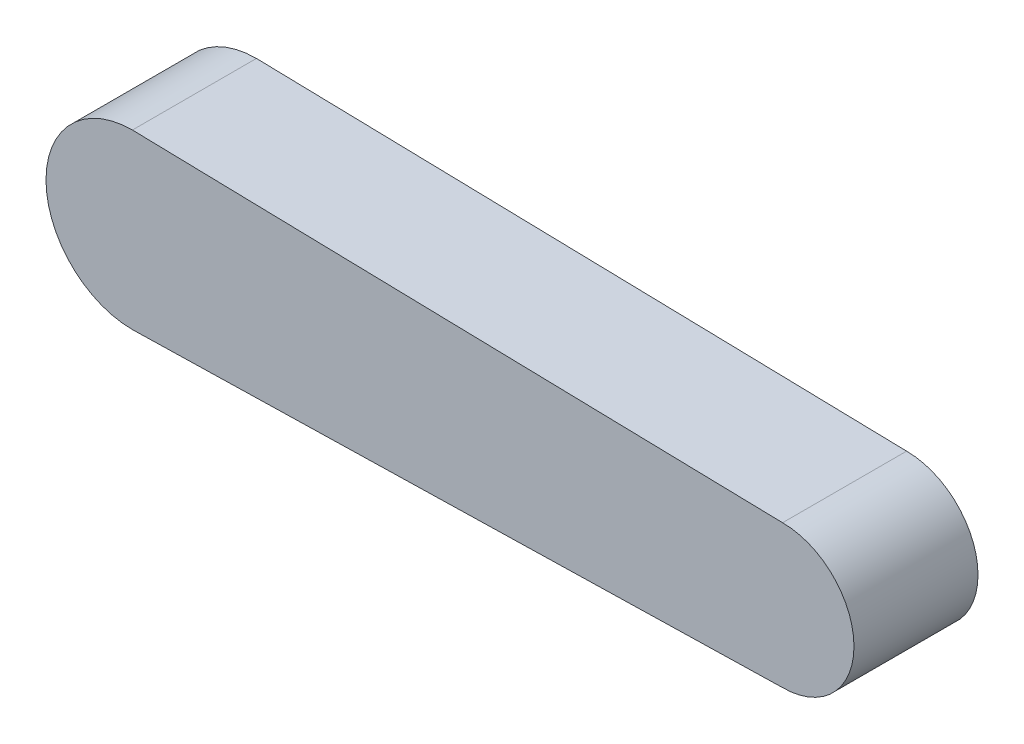
ISO-10303-21;
HEADER;
FILE_DESCRIPTION(('STEP AP214'),'2;1');
FILE_NAME('part.step','',(''),(''),'','','');
FILE_SCHEMA(('AUTOMOTIVE_DESIGN { 1 0 10303 214 1 1 1 1 }'));
ENDSEC;
DATA;
#1=APPLICATION_CONTEXT('core data for automotive mechanical design processes');
#2=APPLICATION_PROTOCOL_DEFINITION('international standard','automotive_design',2000,#1);
#3=PRODUCT_CONTEXT('',#1,'mechanical');
#4=PRODUCT('Part','Part','',(#3));
#5=PRODUCT_RELATED_PRODUCT_CATEGORY('part','',(#4));
#6=PRODUCT_DEFINITION_FORMATION('','',#4);
#7=PRODUCT_DEFINITION_CONTEXT('part definition',#1,'design');
#8=PRODUCT_DEFINITION('design','',#6,#7);
#9=PRODUCT_DEFINITION_SHAPE('','',#8);
#10=(LENGTH_UNIT() NAMED_UNIT(*) SI_UNIT(.MILLI.,.METRE.));
#11=(NAMED_UNIT(*) PLANE_ANGLE_UNIT() SI_UNIT($,.RADIAN.));
#12=(NAMED_UNIT(*) SI_UNIT($,.STERADIAN.) SOLID_ANGLE_UNIT());
#13=UNCERTAINTY_MEASURE_WITH_UNIT(LENGTH_MEASURE(1.E-05),#10,'distance_accuracy_value','');
#14=(GEOMETRIC_REPRESENTATION_CONTEXT(3) GLOBAL_UNCERTAINTY_ASSIGNED_CONTEXT((#13)) GLOBAL_UNIT_ASSIGNED_CONTEXT((#10,
#11,#12)) REPRESENTATION_CONTEXT('',''));
#15=CARTESIAN_POINT('',(0.,0.,0.));
#16=DIRECTION('',(0.,0.,1.));
#17=DIRECTION('',(1.,0.,0.));
#18=AXIS2_PLACEMENT_3D('',#15,#16,#17);
#19=CARTESIAN_POINT('',(17.3,0.,3.3));
#20=DIRECTION('',(0.,0.,-1.));
#21=DIRECTION('',(-1.,0.,0.));
#22=AXIS2_PLACEMENT_3D('',#19,#20,#21);
#23=CYLINDRICAL_SURFACE('',#22,1.90000000000001);
#24=CARTESIAN_POINT('',(17.3,0.,0.));
#25=DIRECTION('',(0.,0.,1.));
#26=DIRECTION('',(1.,0.,0.));
#27=AXIS2_PLACEMENT_3D('',#24,#25,#26);
#28=CIRCLE('',#27,1.90000000000001);
#29=CARTESIAN_POINT('',(17.3,-1.90000000000003,0.));
#30=VERTEX_POINT('',#29);
#31=CARTESIAN_POINT('',(17.3,1.9,0.));
#32=VERTEX_POINT('',#31);
#33=EDGE_CURVE('E100',#30,#32,#28,.T.);
#34=ORIENTED_EDGE('',*,*,#33,.T.);
#35=DIRECTION('',(0.,0.,-1.));
#36=VECTOR('',#35,1.);
#37=CARTESIAN_POINT('',(17.3,1.9,3.3));
#38=LINE('',#37,#36);
#39=CARTESIAN_POINT('',(17.3,1.9,3.3));
#40=VERTEX_POINT('',#39);
#41=EDGE_CURVE('E11',#40,#32,#38,.T.);
#42=ORIENTED_EDGE('',*,*,#41,.F.);
#43=CARTESIAN_POINT('',(17.3,0.,3.3));
#44=DIRECTION('',(0.,0.,1.));
#45=DIRECTION('',(1.,0.,0.));
#46=AXIS2_PLACEMENT_3D('',#43,#44,#45);
#47=CIRCLE('',#46,1.90000000000001);
#48=CARTESIAN_POINT('',(17.3,-1.90000000000003,3.3));
#49=VERTEX_POINT('',#48);
#50=EDGE_CURVE('E88',#49,#40,#47,.T.);
#51=ORIENTED_EDGE('',*,*,#50,.F.);
#52=DIRECTION('',(0.,0.,-1.));
#53=VECTOR('',#52,1.);
#54=CARTESIAN_POINT('',(17.3,-1.90000000000003,3.3));
#55=LINE('',#54,#53);
#56=EDGE_CURVE('E96',#49,#30,#55,.T.);
#57=ORIENTED_EDGE('',*,*,#56,.T.);
#58=EDGE_LOOP('',(#34,#42,#51,#57));
#59=FACE_BOUND('',#58,.T.);
#60=ADVANCED_FACE('F37',(#59),#23,.T.);
#61=CARTESIAN_POINT('',(0.,2.3,3.3));
#62=DIRECTION('',(-0.0231152094300736,-0.99973280785068,0.));
#63=DIRECTION('',(0.99973280785068,-0.0231152094300736,0.));
#64=AXIS2_PLACEMENT_3D('',#61,#62,#63);
#65=PLANE('',#64);
#66=DIRECTION('',(-0.99973280785068,0.0231152094300736,0.));
#67=VECTOR('',#66,1.);
#68=CARTESIAN_POINT('',(0.,2.3,0.));
#69=LINE('',#68,#67);
#70=CARTESIAN_POINT('',(0.,2.3,0.));
#71=VERTEX_POINT('',#70);
#72=EDGE_CURVE('E92',#32,#71,#69,.T.);
#73=ORIENTED_EDGE('',*,*,#72,.T.);
#74=DIRECTION('',(0.,0.,-1.));
#75=VECTOR('',#74,1.);
#76=CARTESIAN_POINT('',(0.,2.3,3.3));
#77=LINE('',#76,#75);
#78=CARTESIAN_POINT('',(0.,2.3,3.3));
#79=VERTEX_POINT('',#78);
#80=EDGE_CURVE('E45',#79,#71,#77,.T.);
#81=ORIENTED_EDGE('',*,*,#80,.F.);
#82=DIRECTION('',(-0.99973280785068,0.0231152094300736,0.));
#83=VECTOR('',#82,1.);
#84=CARTESIAN_POINT('',(0.,2.3,3.3));
#85=LINE('',#84,#83);
#86=EDGE_CURVE('E83',#40,#79,#85,.T.);
#87=ORIENTED_EDGE('',*,*,#86,.F.);
#88=ORIENTED_EDGE('',*,*,#41,.T.);
#89=EDGE_LOOP('',(#73,#81,#87,#88));
#90=FACE_BOUND('',#89,.T.);
#91=ADVANCED_FACE('F91',(#90),#65,.F.);
#92=CARTESIAN_POINT('',(0.,0.,3.3));
#93=DIRECTION('',(0.,0.,-1.));
#94=DIRECTION('',(-1.,0.,0.));
#95=AXIS2_PLACEMENT_3D('',#92,#93,#94);
#96=CYLINDRICAL_SURFACE('',#95,2.3);
#97=CARTESIAN_POINT('',(0.,0.,0.));
#98=DIRECTION('',(0.,0.,1.));
#99=DIRECTION('',(1.,0.,0.));
#100=AXIS2_PLACEMENT_3D('',#97,#98,#99);
#101=CIRCLE('',#100,2.3);
#102=CARTESIAN_POINT('',(0.,-2.3,0.));
#103=VERTEX_POINT('',#102);
#104=EDGE_CURVE('E70',#71,#103,#101,.T.);
#105=ORIENTED_EDGE('',*,*,#104,.T.);
#106=DIRECTION('',(0.,0.,-1.));
#107=VECTOR('',#106,1.);
#108=CARTESIAN_POINT('',(0.,-2.3,3.3));
#109=LINE('',#108,#107);
#110=CARTESIAN_POINT('',(0.,-2.3,3.3));
#111=VERTEX_POINT('',#110);
#112=EDGE_CURVE('E93',#111,#103,#109,.T.);
#113=ORIENTED_EDGE('',*,*,#112,.F.);
#114=CARTESIAN_POINT('',(0.,0.,3.3));
#115=DIRECTION('',(0.,0.,1.));
#116=DIRECTION('',(1.,0.,0.));
#117=AXIS2_PLACEMENT_3D('',#114,#115,#116);
#118=CIRCLE('',#117,2.3);
#119=EDGE_CURVE('E86',#79,#111,#118,.T.);
#120=ORIENTED_EDGE('',*,*,#119,.F.);
#121=ORIENTED_EDGE('',*,*,#80,.T.);
#122=EDGE_LOOP('',(#105,#113,#120,#121));
#123=FACE_BOUND('',#122,.T.);
#124=ADVANCED_FACE('F94',(#123),#96,.T.);
#125=CARTESIAN_POINT('',(0.,-2.3,3.3));
#126=DIRECTION('',(-0.0231152094300719,0.99973280785068,0.));
#127=DIRECTION('',(-0.99973280785068,-0.0231152094300719,0.));
#128=AXIS2_PLACEMENT_3D('',#125,#126,#127);
#129=PLANE('',#128);
#130=DIRECTION('',(0.99973280785068,0.0231152094300719,0.));
#131=VECTOR('',#130,1.);
#132=CARTESIAN_POINT('',(0.,-2.3,0.));
#133=LINE('',#132,#131);
#134=EDGE_CURVE('E76',#103,#30,#133,.T.);
#135=ORIENTED_EDGE('',*,*,#134,.T.);
#136=ORIENTED_EDGE('',*,*,#56,.F.);
#137=DIRECTION('',(0.99973280785068,0.0231152094300719,0.));
#138=VECTOR('',#137,1.);
#139=CARTESIAN_POINT('',(0.,-2.3,3.3));
#140=LINE('',#139,#138);
#141=EDGE_CURVE('E53',#111,#49,#140,.T.);
#142=ORIENTED_EDGE('',*,*,#141,.F.);
#143=ORIENTED_EDGE('',*,*,#112,.T.);
#144=EDGE_LOOP('',(#135,#136,#142,#143));
#145=FACE_BOUND('',#144,.T.);
#146=ADVANCED_FACE('F107',(#145),#129,.F.);
#147=CARTESIAN_POINT('',(17.3,0.,3.3));
#148=DIRECTION('',(0.,0.,1.));
#149=DIRECTION('',(1.,0.,0.));
#150=AXIS2_PLACEMENT_3D('',#147,#148,#149);
#151=PLANE('',#150);
#152=ORIENTED_EDGE('',*,*,#50,.T.);
#153=ORIENTED_EDGE('',*,*,#86,.T.);
#154=ORIENTED_EDGE('',*,*,#119,.T.);
#155=ORIENTED_EDGE('',*,*,#141,.T.);
#156=EDGE_LOOP('',(#152,#153,#154,#155));
#157=FACE_BOUND('',#156,.T.);
#158=ADVANCED_FACE('F84',(#157),#151,.T.);
#159=CARTESIAN_POINT('',(17.3,0.,0.));
#160=DIRECTION('',(0.,0.,1.));
#161=DIRECTION('',(1.,0.,0.));
#162=AXIS2_PLACEMENT_3D('',#159,#160,#161);
#163=PLANE('',#162);
#164=ORIENTED_EDGE('',*,*,#33,.F.);
#165=ORIENTED_EDGE('',*,*,#134,.F.);
#166=ORIENTED_EDGE('',*,*,#104,.F.);
#167=ORIENTED_EDGE('',*,*,#72,.F.);
#168=EDGE_LOOP('',(#164,#165,#166,#167));
#169=FACE_BOUND('',#168,.T.);
#170=ADVANCED_FACE('F110',(#169),#163,.F.);
#171=CLOSED_SHELL('',(#60,#91,#124,#146,#158,#170));
#172=MANIFOLD_SOLID_BREP('B2',#171);
#173=ADVANCED_BREP_SHAPE_REPRESENTATION('',(#18,#172),#14);
#174=SHAPE_DEFINITION_REPRESENTATION(#9,#173);
ENDSEC;
END-ISO-10303-21;
